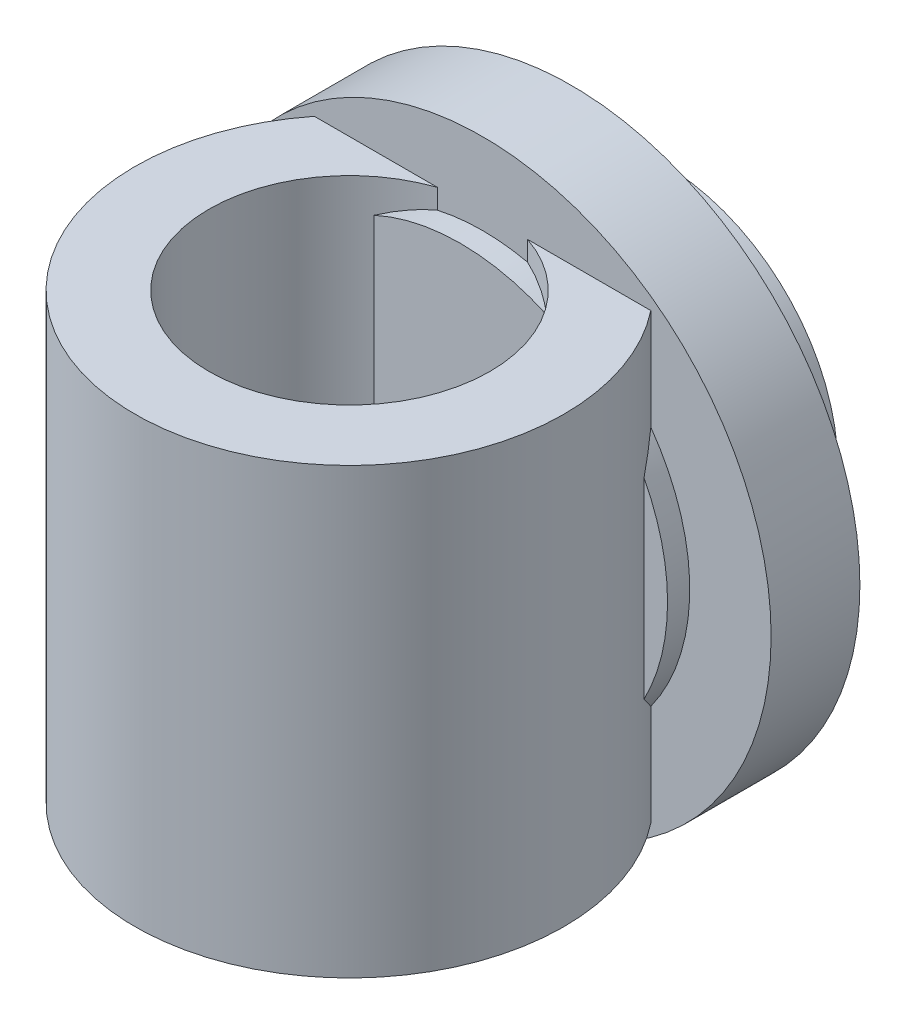
ISO-10303-21;
HEADER;
FILE_DESCRIPTION(('STEP AP214'),'2;1');
FILE_NAME('part.step','',(''),(''),'','','');
FILE_SCHEMA(('AUTOMOTIVE_DESIGN { 1 0 10303 214 1 1 1 1 }'));
ENDSEC;
DATA;
#1=APPLICATION_CONTEXT('core data for automotive mechanical design processes');
#2=APPLICATION_PROTOCOL_DEFINITION('international standard','automotive_design',2000,#1);
#3=PRODUCT_CONTEXT('',#1,'mechanical');
#4=PRODUCT('Part','Part','',(#3));
#5=PRODUCT_RELATED_PRODUCT_CATEGORY('part','',(#4));
#6=PRODUCT_DEFINITION_FORMATION('','',#4);
#7=PRODUCT_DEFINITION_CONTEXT('part definition',#1,'design');
#8=PRODUCT_DEFINITION('design','',#6,#7);
#9=PRODUCT_DEFINITION_SHAPE('','',#8);
#10=(LENGTH_UNIT() NAMED_UNIT(*) SI_UNIT(.MILLI.,.METRE.));
#11=(NAMED_UNIT(*) PLANE_ANGLE_UNIT() SI_UNIT($,.RADIAN.));
#12=(NAMED_UNIT(*) SI_UNIT($,.STERADIAN.) SOLID_ANGLE_UNIT());
#13=UNCERTAINTY_MEASURE_WITH_UNIT(LENGTH_MEASURE(1.E-05),#10,'distance_accuracy_value','');
#14=(GEOMETRIC_REPRESENTATION_CONTEXT(3) GLOBAL_UNCERTAINTY_ASSIGNED_CONTEXT((#13)) GLOBAL_UNIT_ASSIGNED_CONTEXT((#10,
#11,#12)) REPRESENTATION_CONTEXT('',''));
#15=CARTESIAN_POINT('',(0.,0.,0.));
#16=DIRECTION('',(0.,0.,1.));
#17=DIRECTION('',(1.,0.,0.));
#18=AXIS2_PLACEMENT_3D('',#15,#16,#17);
#19=CARTESIAN_POINT('',(0.,0.,30.));
#20=DIRECTION('',(0.,0.,-1.));
#21=DIRECTION('',(-1.,0.,0.));
#22=AXIS2_PLACEMENT_3D('',#19,#20,#21);
#23=CYLINDRICAL_SURFACE('',#22,56.);
#24=CARTESIAN_POINT('',(-23.3238075793812,50.9116882454314,30.));
#25=CARTESIAN_POINT('',(-22.9114463088715,51.1005986286156,29.679419453639));
#26=CARTESIAN_POINT('',(-22.4917791768786,51.286795759074,29.366774842377));
#27=CARTESIAN_POINT('',(-21.6379864935328,51.6528165478896,28.7578360118919));
#28=CARTESIAN_POINT('',(-21.2038595590568,51.8326395931312,28.4615433640263));
#29=CARTESIAN_POINT('',(-19.8870844854698,52.3583008328965,27.6025317360215));
#30=CARTESIAN_POINT('',(-18.9835434950026,52.6933341201847,27.0646190917798));
#31=CARTESIAN_POINT('',(-17.5897673686336,53.1680500647409,26.3120303610085));
#32=CARTESIAN_POINT('',(-17.1186545371853,53.3216810581021,26.0701659874231));
#33=CARTESIAN_POINT('',(-16.1640860022691,53.618765837311,25.6051738803134));
#34=CARTESIAN_POINT('',(-15.6806306210854,53.7622198885263,25.3820456582087));
#35=CARTESIAN_POINT('',(-14.6983501049661,54.0390674144541,24.9536338727811));
#36=CARTESIAN_POINT('',(-14.1994357269894,54.1723755958581,24.7484997656888));
#37=CARTESIAN_POINT('',(-13.1905511740558,54.4268353481768,24.3587035789901));
#38=CARTESIAN_POINT('',(-12.6805794635909,54.5479852173736,24.1740443647398));
#39=CARTESIAN_POINT('',(-12.1655250605964,54.6626014748658,24.));
#40=B_SPLINE_CURVE_WITH_KNOTS('',3,(#24,#25,#26,#27,#28,#29,#30,#31,#32,#33,#34,#35,#36,#37,#38,
#39),.UNSPECIFIED.,.F.,.F.,(4,2,2,2,2,2,2,4),(0.,1.6660040475292,3.33216791353041,
6.63827210156887,8.29206644048741,9.9458176402171,11.6122112121105,13.2788376936681),.UNSPECIFIED.);
#41=CARTESIAN_POINT('',(-23.3238075793812,50.9116882454314,30.));
#42=VERTEX_POINT('',#41);
#43=CARTESIAN_POINT('',(-12.1655250605964,54.6626014748658,24.));
#44=VERTEX_POINT('',#43);
#45=EDGE_CURVE('E213',#42,#44,#40,.T.);
#46=ORIENTED_EDGE('',*,*,#45,.F.);
#47=CARTESIAN_POINT('',(0.,0.,30.));
#48=DIRECTION('',(0.,0.,1.));
#49=DIRECTION('',(1.,0.,0.));
#50=AXIS2_PLACEMENT_3D('',#47,#48,#49);
#51=CIRCLE('',#50,56.);
#52=CARTESIAN_POINT('',(23.3238075793812,50.9116882454314,30.));
#53=VERTEX_POINT('',#52);
#54=EDGE_CURVE('E165',#53,#42,#51,.T.);
#55=ORIENTED_EDGE('',*,*,#54,.F.);
#56=CARTESIAN_POINT('',(12.1655250605964,54.6626014748658,24.));
#57=CARTESIAN_POINT('',(12.6805794635909,54.5479852173736,24.1740443647398));
#58=CARTESIAN_POINT('',(13.1905511740558,54.4268353481768,24.3587035789901));
#59=CARTESIAN_POINT('',(14.1994357269894,54.1723755958581,24.7484997656888));
#60=CARTESIAN_POINT('',(14.6983501049661,54.0390674144541,24.9536338727811));
#61=CARTESIAN_POINT('',(15.6806306210854,53.7622198885263,25.3820456582087));
#62=CARTESIAN_POINT('',(16.1640860022691,53.618765837311,25.6051738803134));
#63=CARTESIAN_POINT('',(17.1186545371853,53.3216810581021,26.0701659874231));
#64=CARTESIAN_POINT('',(17.5897673686336,53.1680500647409,26.3120303610085));
#65=CARTESIAN_POINT('',(18.9835434950026,52.6933341201847,27.0646190917798));
#66=CARTESIAN_POINT('',(19.8870844854698,52.3583008328965,27.6025317360215));
#67=CARTESIAN_POINT('',(21.2038595590568,51.8326395931312,28.4615433640263));
#68=CARTESIAN_POINT('',(21.6379864935328,51.6528165478896,28.7578360118919));
#69=CARTESIAN_POINT('',(22.4917791768786,51.286795759074,29.366774842377));
#70=CARTESIAN_POINT('',(22.9114463088715,51.1005986286156,29.679419453639));
#71=CARTESIAN_POINT('',(23.3238075793812,50.9116882454314,30.));
#72=B_SPLINE_CURVE_WITH_KNOTS('',3,(#56,#57,#58,#59,#60,#61,#62,#63,#64,#65,#66,#67,#68,#69,#70,
#71),.UNSPECIFIED.,.F.,.F.,(4,2,2,2,2,2,2,4),(0.,1.66662648155761,3.33302005345105,
4.98677125318074,6.64056559209927,9.94666978013773,11.6128336461389,13.2788376936681),.UNSPECIFIED.);
#73=CARTESIAN_POINT('',(12.1655250605964,54.6626014748658,24.));
#74=VERTEX_POINT('',#73);
#75=EDGE_CURVE('E63',#74,#53,#72,.T.);
#76=ORIENTED_EDGE('',*,*,#75,.F.);
#77=CARTESIAN_POINT('',(0.,0.,24.));
#78=DIRECTION('',(0.,0.,1.));
#79=DIRECTION('',(1.,0.,0.));
#80=AXIS2_PLACEMENT_3D('',#77,#78,#79);
#81=CIRCLE('',#80,56.);
#82=EDGE_CURVE('E177',#44,#74,#81,.F.);
#83=ORIENTED_EDGE('',*,*,#82,.F.);
#84=EDGE_LOOP('',(#46,#55,#76,#83));
#85=FACE_BOUND('',#84,.T.);
#86=ADVANCED_FACE('F41',(#85),#23,.T.);
#87=CARTESIAN_POINT('',(23.3238075793812,-50.9116882454314,30.));
#88=CARTESIAN_POINT('',(22.9114463088715,-51.1005986286156,29.679419453639));
#89=CARTESIAN_POINT('',(22.4917791768786,-51.286795759074,29.366774842377));
#90=CARTESIAN_POINT('',(21.6379864935328,-51.6528165478896,28.7578360118919));
#91=CARTESIAN_POINT('',(21.2038595590568,-51.8326395931312,28.4615433640263));
#92=CARTESIAN_POINT('',(19.8870844854698,-52.3583008328965,27.6025317360215));
#93=CARTESIAN_POINT('',(18.9835434950026,-52.6933341201847,27.0646190917798));
#94=CARTESIAN_POINT('',(17.5897673686336,-53.1680500647409,26.3120303610085));
#95=CARTESIAN_POINT('',(17.1186545371853,-53.3216810581021,26.0701659874231));
#96=CARTESIAN_POINT('',(16.1640860022691,-53.618765837311,25.6051738803134));
#97=CARTESIAN_POINT('',(15.6806306210854,-53.7622198885263,25.3820456582087));
#98=CARTESIAN_POINT('',(14.6983501049661,-54.0390674144541,24.9536338727811));
#99=CARTESIAN_POINT('',(14.1994357269894,-54.1723755958581,24.7484997656888));
#100=CARTESIAN_POINT('',(13.1905511740558,-54.4268353481768,24.3587035789901));
#101=CARTESIAN_POINT('',(12.6805794635909,-54.5479852173736,24.1740443647398));
#102=CARTESIAN_POINT('',(12.1655250605964,-54.6626014748658,24.));
#103=B_SPLINE_CURVE_WITH_KNOTS('',3,(#87,#88,#89,#90,#91,#92,#93,#94,#95,#96,#97,#98,#99,#100,
#101,#102),.UNSPECIFIED.,.F.,.F.,(4,2,2,2,2,2,2,4),(0.,1.6660040475292,3.33216791353041,
6.63827210156887,8.29206644048741,9.9458176402171,11.6122112121105,13.2788376936681),.UNSPECIFIED.);
#104=CARTESIAN_POINT('',(23.3238075793812,-50.9116882454314,30.));
#105=VERTEX_POINT('',#104);
#106=CARTESIAN_POINT('',(12.1655250605964,-54.6626014748658,24.));
#107=VERTEX_POINT('',#106);
#108=EDGE_CURVE('E134',#105,#107,#103,.T.);
#109=ORIENTED_EDGE('',*,*,#108,.F.);
#110=CARTESIAN_POINT('',(-23.3238075793812,-50.9116882454314,30.));
#111=VERTEX_POINT('',#110);
#112=EDGE_CURVE('E163',#111,#105,#51,.T.);
#113=ORIENTED_EDGE('',*,*,#112,.F.);
#114=CARTESIAN_POINT('',(-12.1655250605964,-54.6626014748658,24.));
#115=CARTESIAN_POINT('',(-12.6805794635909,-54.5479852173736,24.1740443647398));
#116=CARTESIAN_POINT('',(-13.1905511740558,-54.4268353481768,24.3587035789901));
#117=CARTESIAN_POINT('',(-14.1994357269894,-54.1723755958581,24.7484997656888));
#118=CARTESIAN_POINT('',(-14.6983501049661,-54.0390674144541,24.9536338727811));
#119=CARTESIAN_POINT('',(-15.6806306210854,-53.7622198885263,25.3820456582087));
#120=CARTESIAN_POINT('',(-16.1640860022691,-53.618765837311,25.6051738803134));
#121=CARTESIAN_POINT('',(-17.1186545371853,-53.3216810581021,26.0701659874231));
#122=CARTESIAN_POINT('',(-17.5897673686336,-53.1680500647409,26.3120303610085));
#123=CARTESIAN_POINT('',(-18.9835434950026,-52.6933341201847,27.0646190917798));
#124=CARTESIAN_POINT('',(-19.8870844854698,-52.3583008328965,27.6025317360215));
#125=CARTESIAN_POINT('',(-21.2038595590568,-51.8326395931312,28.4615433640263));
#126=CARTESIAN_POINT('',(-21.6379864935328,-51.6528165478896,28.7578360118919));
#127=CARTESIAN_POINT('',(-22.4917791768786,-51.286795759074,29.366774842377));
#128=CARTESIAN_POINT('',(-22.9114463088715,-51.1005986286156,29.679419453639));
#129=CARTESIAN_POINT('',(-23.3238075793812,-50.9116882454314,30.));
#130=B_SPLINE_CURVE_WITH_KNOTS('',3,(#114,#115,#116,#117,#118,#119,#120,#121,#122,#123,#124,
#125,#126,#127,#128,#129),.UNSPECIFIED.,.F.,.F.,(4,2,2,2,2,2,2,4),(0.,1.66662648155761,
3.33302005345105,4.98677125318074,6.64056559209927,9.94666978013773,11.6128336461389,
13.2788376936681),.UNSPECIFIED.);
#131=CARTESIAN_POINT('',(-12.1655250605964,-54.6626014748658,24.));
#132=VERTEX_POINT('',#131);
#133=EDGE_CURVE('E56',#132,#111,#130,.T.);
#134=ORIENTED_EDGE('',*,*,#133,.F.);
#135=EDGE_CURVE('E178',#107,#132,#81,.F.);
#136=ORIENTED_EDGE('',*,*,#135,.F.);
#137=EDGE_LOOP('',(#109,#113,#134,#136));
#138=FACE_BOUND('',#137,.T.);
#139=ADVANCED_FACE('F295',(#138),#23,.T.);
#140=CARTESIAN_POINT('',(49.6386945839634,-25.9229627936314,30.));
#141=VERTEX_POINT('',#140);
#142=CARTESIAN_POINT('',(49.6386945839634,25.9229627936314,30.));
#143=VERTEX_POINT('',#142);
#144=EDGE_CURVE('E159',#141,#143,#51,.T.);
#145=ORIENTED_EDGE('',*,*,#144,.F.);
#146=CARTESIAN_POINT('',(49.6386945839634,-25.9229627936314,30.));
#147=CARTESIAN_POINT('',(49.333693233163,-26.5069550941336,29.4953198767346));
#148=CARTESIAN_POINT('',(49.0183215734381,-27.0857687861314,28.9909024543813));
#149=CARTESIAN_POINT('',(48.3668739351372,-28.2326159982287,27.9843111797481));
#150=CARTESIAN_POINT('',(48.0308151820166,-28.800657985484,27.4821358245194));
#151=CARTESIAN_POINT('',(47.3375267241778,-29.9265023584691,26.4809096570789));
#152=CARTESIAN_POINT('',(46.9802968701535,-30.4843046719487,25.9818588669301));
#153=CARTESIAN_POINT('',(46.2441013604613,-31.5899377656625,24.9876292203131));
#154=CARTESIAN_POINT('',(45.8651180720958,-32.1377599686688,24.4924538853822));
#155=CARTESIAN_POINT('',(45.4752680036083,-32.6802692767364,24.));
#156=B_SPLINE_CURVE_WITH_KNOTS('',3,(#146,#147,#148,#149,#150,#151,#152,#153,#154,#155),
.UNSPECIFIED.,.F.,.F.,(4,2,2,2,4),(0.,2.48970342110896,4.97736107866957,7.46503628217485,
9.95475720673111),.UNSPECIFIED.);
#157=CARTESIAN_POINT('',(45.4752680036083,-32.6802692767364,24.));
#158=VERTEX_POINT('',#157);
#159=EDGE_CURVE('E166',#141,#158,#156,.T.);
#160=ORIENTED_EDGE('',*,*,#159,.T.);
#161=CARTESIAN_POINT('',(45.4752680036083,32.6802692767364,24.));
#162=VERTEX_POINT('',#161);
#163=EDGE_CURVE('E156',#162,#158,#81,.F.);
#164=ORIENTED_EDGE('',*,*,#163,.F.);
#165=CARTESIAN_POINT('',(45.4752680036083,32.6802692767364,24.));
#166=CARTESIAN_POINT('',(45.8651180720958,32.1377599686688,24.4924538853822));
#167=CARTESIAN_POINT('',(46.2441013604613,31.5899377656625,24.9876292203131));
#168=CARTESIAN_POINT('',(46.9802968701535,30.4843046719487,25.9818588669301));
#169=CARTESIAN_POINT('',(47.3375267241778,29.9265023584691,26.4809096570789));
#170=CARTESIAN_POINT('',(48.0308151820166,28.800657985484,27.4821358245194));
#171=CARTESIAN_POINT('',(48.3668739351372,28.2326159982287,27.9843111797481));
#172=CARTESIAN_POINT('',(49.0183215734381,27.0857687861314,28.9909024543813));
#173=CARTESIAN_POINT('',(49.333693233163,26.5069550941336,29.4953198767346));
#174=CARTESIAN_POINT('',(49.6386945839634,25.9229627936314,30.));
#175=B_SPLINE_CURVE_WITH_KNOTS('',3,(#165,#166,#167,#168,#169,#170,#171,#172,#173,#174),
.UNSPECIFIED.,.F.,.F.,(4,2,2,2,4),(0.,2.48972092455627,4.97739612806154,7.46505378562215,
9.95475720673111),.UNSPECIFIED.);
#176=EDGE_CURVE('E276',#162,#143,#175,.T.);
#177=ORIENTED_EDGE('',*,*,#176,.T.);
#178=EDGE_LOOP('',(#145,#160,#164,#177));
#179=FACE_BOUND('',#178,.T.);
#180=ADVANCED_FACE('F301',(#179),#23,.T.);
#181=CARTESIAN_POINT('',(0.,0.,30.));
#182=DIRECTION('',(0.,0.,1.));
#183=DIRECTION('',(1.,0.,0.));
#184=AXIS2_PLACEMENT_3D('',#181,#182,#183);
#185=PLANE('',#184);
#186=ORIENTED_EDGE('',*,*,#112,.T.);
#187=DIRECTION('',(0.,1.,0.));
#188=VECTOR('',#187,1.);
#189=CARTESIAN_POINT('',(23.3238075793812,-60.,30.));
#190=LINE('',#189,#188);
#191=EDGE_CURVE('E193',#105,#53,#190,.T.);
#192=ORIENTED_EDGE('',*,*,#191,.T.);
#193=ORIENTED_EDGE('',*,*,#54,.T.);
#194=DIRECTION('',(0.,1.,0.));
#195=VECTOR('',#194,1.);
#196=CARTESIAN_POINT('',(-23.3238075793812,-60.,30.));
#197=LINE('',#196,#195);
#198=EDGE_CURVE('E189',#42,#111,#197,.F.);
#199=ORIENTED_EDGE('',*,*,#198,.T.);
#200=EDGE_LOOP('',(#186,#192,#193,#199));
#201=FACE_BOUND('',#200,.T.);
#202=ADVANCED_FACE('F311',(#201),#185,.T.);
#203=DIRECTION('',(0.,1.,0.));
#204=VECTOR('',#203,1.);
#205=CARTESIAN_POINT('',(49.6386945839634,-60.,30.));
#206=LINE('',#205,#204);
#207=EDGE_CURVE('E197',#141,#143,#206,.T.);
#208=ORIENTED_EDGE('',*,*,#207,.F.);
#209=ORIENTED_EDGE('',*,*,#144,.T.);
#210=EDGE_LOOP('',(#208,#209));
#211=FACE_BOUND('',#210,.T.);
#212=ADVANCED_FACE('F312',(#211),#185,.T.);
#213=CARTESIAN_POINT('',(0.,0.,-25.));
#214=DIRECTION('',(0.,0.,1.));
#215=DIRECTION('',(1.,0.,0.));
#216=AXIS2_PLACEMENT_3D('',#213,#214,#215);
#217=CYLINDRICAL_SURFACE('',#216,47.);
#218=CARTESIAN_POINT('',(0.,0.,-25.));
#219=DIRECTION('',(0.,0.,1.));
#220=DIRECTION('',(1.,0.,0.));
#221=AXIS2_PLACEMENT_3D('',#218,#219,#220);
#222=CIRCLE('',#221,47.);
#223=CARTESIAN_POINT('',(47.,0.,-25.));
#224=VERTEX_POINT('',#223);
#225=EDGE_CURVE('E186',#224,#224,#222,.T.);
#226=ORIENTED_EDGE('',*,*,#225,.T.);
#227=EDGE_LOOP('',(#226));
#228=FACE_BOUND('',#227,.T.);
#229=CARTESIAN_POINT('',(0.,0.,0.));
#230=DIRECTION('',(0.,0.,1.));
#231=DIRECTION('',(1.,0.,0.));
#232=AXIS2_PLACEMENT_3D('',#229,#230,#231);
#233=CIRCLE('',#232,47.);
#234=CARTESIAN_POINT('',(47.,0.,0.));
#235=VERTEX_POINT('',#234);
#236=EDGE_CURVE('E182',#235,#235,#233,.T.);
#237=ORIENTED_EDGE('',*,*,#236,.F.);
#238=EDGE_LOOP('',(#237));
#239=FACE_BOUND('',#238,.T.);
#240=ADVANCED_FACE('F43',(#228,#239),#217,.T.);
#241=CARTESIAN_POINT('',(0.,0.,-25.));
#242=DIRECTION('',(0.,0.,1.));
#243=DIRECTION('',(1.,0.,0.));
#244=AXIS2_PLACEMENT_3D('',#241,#242,#243);
#245=PLANE('',#244);
#246=ORIENTED_EDGE('',*,*,#225,.F.);
#247=EDGE_LOOP('',(#246));
#248=FACE_BOUND('',#247,.T.);
#249=ADVANCED_FACE('F328',(#248),#245,.F.);
#250=CARTESIAN_POINT('',(0.,0.,24.));
#251=DIRECTION('',(0.,0.,-1.));
#252=DIRECTION('',(-1.,0.,0.));
#253=AXIS2_PLACEMENT_3D('',#250,#251,#252);
#254=CYLINDRICAL_SURFACE('',#253,78.);
#255=CARTESIAN_POINT('',(0.,0.,24.));
#256=DIRECTION('',(0.,0.,1.));
#257=DIRECTION('',(1.,0.,0.));
#258=AXIS2_PLACEMENT_3D('',#255,#256,#257);
#259=CIRCLE('',#258,78.);
#260=CARTESIAN_POINT('',(78.,0.,24.));
#261=VERTEX_POINT('',#260);
#262=EDGE_CURVE('E179',#261,#261,#259,.T.);
#263=ORIENTED_EDGE('',*,*,#262,.F.);
#264=EDGE_LOOP('',(#263));
#265=FACE_BOUND('',#264,.T.);
#266=CARTESIAN_POINT('',(0.,0.,0.));
#267=DIRECTION('',(0.,0.,1.));
#268=DIRECTION('',(1.,0.,0.));
#269=AXIS2_PLACEMENT_3D('',#266,#267,#268);
#270=CIRCLE('',#269,78.);
#271=CARTESIAN_POINT('',(78.,0.,0.));
#272=VERTEX_POINT('',#271);
#273=EDGE_CURVE('E183',#272,#272,#270,.T.);
#274=ORIENTED_EDGE('',*,*,#273,.T.);
#275=EDGE_LOOP('',(#274));
#276=FACE_BOUND('',#275,.T.);
#277=ADVANCED_FACE('F333',(#265,#276),#254,.T.);
#278=CARTESIAN_POINT('',(0.,0.,24.));
#279=DIRECTION('',(0.,0.,1.));
#280=DIRECTION('',(1.,0.,0.));
#281=AXIS2_PLACEMENT_3D('',#278,#279,#280);
#282=PLANE('',#281);
#283=DIRECTION('',(0.,1.,0.));
#284=VECTOR('',#283,1.);
#285=CARTESIAN_POINT('',(45.4752680036083,-60.,24.));
#286=LINE('',#285,#284);
#287=CARTESIAN_POINT('',(45.4752680036083,-60.,24.));
#288=VERTEX_POINT('',#287);
#289=EDGE_CURVE('E153',#288,#158,#286,.T.);
#290=ORIENTED_EDGE('',*,*,#289,.F.);
#291=DIRECTION('',(-1.,0.,0.));
#292=VECTOR('',#291,1.);
#293=CARTESIAN_POINT('',(0.,-60.,24.));
#294=LINE('',#293,#292);
#295=CARTESIAN_POINT('',(12.1655250605964,-60.,24.));
#296=VERTEX_POINT('',#295);
#297=EDGE_CURVE('E11',#288,#296,#294,.T.);
#298=ORIENTED_EDGE('',*,*,#297,.T.);
#299=DIRECTION('',(0.,1.,0.));
#300=VECTOR('',#299,1.);
#301=CARTESIAN_POINT('',(12.1655250605964,-60.,24.));
#302=LINE('',#301,#300);
#303=EDGE_CURVE('E128',#296,#107,#302,.T.);
#304=ORIENTED_EDGE('',*,*,#303,.T.);
#305=ORIENTED_EDGE('',*,*,#135,.T.);
#306=DIRECTION('',(0.,1.,0.));
#307=VECTOR('',#306,1.);
#308=CARTESIAN_POINT('',(-12.1655250605964,-60.,24.));
#309=LINE('',#308,#307);
#310=CARTESIAN_POINT('',(-12.1655250605964,-60.,24.));
#311=VERTEX_POINT('',#310);
#312=EDGE_CURVE('E211',#132,#311,#309,.F.);
#313=ORIENTED_EDGE('',*,*,#312,.T.);
#314=CARTESIAN_POINT('',(-45.4752680036083,-60.,24.));
#315=VERTEX_POINT('',#314);
#316=EDGE_CURVE('E45',#311,#315,#294,.T.);
#317=ORIENTED_EDGE('',*,*,#316,.T.);
#318=DIRECTION('',(0.,1.,0.));
#319=VECTOR('',#318,1.);
#320=CARTESIAN_POINT('',(-45.4752680036083,-60.,24.));
#321=LINE('',#320,#319);
#322=CARTESIAN_POINT('',(-45.4752680036083,-32.6802692767364,24.));
#323=VERTEX_POINT('',#322);
#324=EDGE_CURVE('E209',#323,#315,#321,.F.);
#325=ORIENTED_EDGE('',*,*,#324,.F.);
#326=CARTESIAN_POINT('',(-45.4752680036083,32.6802692767364,24.));
#327=VERTEX_POINT('',#326);
#328=EDGE_CURVE('E286',#323,#327,#81,.F.);
#329=ORIENTED_EDGE('',*,*,#328,.T.);
#330=CARTESIAN_POINT('',(-45.4752680036083,60.,24.));
#331=VERTEX_POINT('',#330);
#332=EDGE_CURVE('E282',#331,#327,#321,.F.);
#333=ORIENTED_EDGE('',*,*,#332,.F.);
#334=DIRECTION('',(-1.,0.,0.));
#335=VECTOR('',#334,1.);
#336=CARTESIAN_POINT('',(0.,60.,24.));
#337=LINE('',#336,#335);
#338=CARTESIAN_POINT('',(-12.1655250605964,60.,24.));
#339=VERTEX_POINT('',#338);
#340=EDGE_CURVE('E198',#339,#331,#337,.T.);
#341=ORIENTED_EDGE('',*,*,#340,.F.);
#342=EDGE_CURVE('E212',#339,#44,#309,.F.);
#343=ORIENTED_EDGE('',*,*,#342,.T.);
#344=ORIENTED_EDGE('',*,*,#82,.T.);
#345=CARTESIAN_POINT('',(12.1655250605964,60.,24.));
#346=VERTEX_POINT('',#345);
#347=EDGE_CURVE('E139',#74,#346,#302,.T.);
#348=ORIENTED_EDGE('',*,*,#347,.T.);
#349=CARTESIAN_POINT('',(45.4752680036083,60.,24.));
#350=VERTEX_POINT('',#349);
#351=EDGE_CURVE('E199',#350,#346,#337,.T.);
#352=ORIENTED_EDGE('',*,*,#351,.F.);
#353=EDGE_CURVE('E160',#162,#350,#286,.T.);
#354=ORIENTED_EDGE('',*,*,#353,.F.);
#355=ORIENTED_EDGE('',*,*,#163,.T.);
#356=EDGE_LOOP('',(#290,#298,#304,#305,#313,#317,#325,#329,#333,#341,#343,#344,#348,#352,#354,#355));
#357=FACE_BOUND('',#356,.T.);
#358=ORIENTED_EDGE('',*,*,#262,.T.);
#359=EDGE_LOOP('',(#358));
#360=FACE_BOUND('',#359,.T.);
#361=ADVANCED_FACE('F150',(#357,#360),#282,.T.);
#362=CARTESIAN_POINT('',(0.,0.,0.));
#363=DIRECTION('',(0.,0.,1.));
#364=DIRECTION('',(1.,0.,0.));
#365=AXIS2_PLACEMENT_3D('',#362,#363,#364);
#366=PLANE('',#365);
#367=ORIENTED_EDGE('',*,*,#273,.F.);
#368=EDGE_LOOP('',(#367));
#369=FACE_BOUND('',#368,.T.);
#370=ORIENTED_EDGE('',*,*,#236,.T.);
#371=EDGE_LOOP('',(#370));
#372=FACE_BOUND('',#371,.T.);
#373=ADVANCED_FACE('F305',(#369,#372),#366,.F.);
#374=CARTESIAN_POINT('',(-49.6386945839634,25.9229627936314,30.));
#375=VERTEX_POINT('',#374);
#376=CARTESIAN_POINT('',(-49.6386945839634,-25.9229627936314,30.));
#377=VERTEX_POINT('',#376);
#378=EDGE_CURVE('E288',#375,#377,#51,.T.);
#379=ORIENTED_EDGE('',*,*,#378,.F.);
#380=CARTESIAN_POINT('',(-49.6386945839634,25.9229627936314,30.));
#381=CARTESIAN_POINT('',(-49.333693233163,26.5069550941336,29.4953198767346));
#382=CARTESIAN_POINT('',(-49.0183215734381,27.0857687861314,28.9909024543813));
#383=CARTESIAN_POINT('',(-48.3668739351372,28.2326159982287,27.9843111797481));
#384=CARTESIAN_POINT('',(-48.0308151820166,28.800657985484,27.4821358245194));
#385=CARTESIAN_POINT('',(-47.3375267241778,29.9265023584691,26.4809096570789));
#386=CARTESIAN_POINT('',(-46.9802968701535,30.4843046719487,25.9818588669301));
#387=CARTESIAN_POINT('',(-46.2441013604613,31.5899377656625,24.9876292203131));
#388=CARTESIAN_POINT('',(-45.8651180720958,32.1377599686688,24.4924538853822));
#389=CARTESIAN_POINT('',(-45.4752680036083,32.6802692767364,24.));
#390=B_SPLINE_CURVE_WITH_KNOTS('',3,(#380,#381,#382,#383,#384,#385,#386,#387,#388,#389),
.UNSPECIFIED.,.F.,.F.,(4,2,2,2,4),(0.,2.48970342110896,4.97736107866957,7.46503628217485,
9.95475720673111),.UNSPECIFIED.);
#391=EDGE_CURVE('E263',#375,#327,#390,.T.);
#392=ORIENTED_EDGE('',*,*,#391,.T.);
#393=ORIENTED_EDGE('',*,*,#328,.F.);
#394=CARTESIAN_POINT('',(-45.4752680036083,-32.6802692767364,24.));
#395=CARTESIAN_POINT('',(-45.8651180720958,-32.1377599686688,24.4924538853822));
#396=CARTESIAN_POINT('',(-46.2441013604613,-31.5899377656625,24.9876292203131));
#397=CARTESIAN_POINT('',(-46.9802968701535,-30.4843046719487,25.9818588669301));
#398=CARTESIAN_POINT('',(-47.3375267241778,-29.9265023584691,26.4809096570789));
#399=CARTESIAN_POINT('',(-48.0308151820166,-28.800657985484,27.4821358245194));
#400=CARTESIAN_POINT('',(-48.3668739351372,-28.2326159982287,27.9843111797481));
#401=CARTESIAN_POINT('',(-49.0183215734381,-27.0857687861314,28.9909024543813));
#402=CARTESIAN_POINT('',(-49.333693233163,-26.5069550941336,29.4953198767346));
#403=CARTESIAN_POINT('',(-49.6386945839634,-25.9229627936314,30.));
#404=B_SPLINE_CURVE_WITH_KNOTS('',3,(#394,#395,#396,#397,#398,#399,#400,#401,#402,#403),
.UNSPECIFIED.,.F.,.F.,(4,2,2,2,4),(0.,2.48972092455627,4.97739612806154,7.46505378562215,
9.95475720673111),.UNSPECIFIED.);
#405=EDGE_CURVE('E138',#323,#377,#404,.T.);
#406=ORIENTED_EDGE('',*,*,#405,.T.);
#407=EDGE_LOOP('',(#379,#392,#393,#406));
#408=FACE_BOUND('',#407,.T.);
#409=ADVANCED_FACE('F233',(#408),#23,.T.);
#410=DIRECTION('',(0.,1.,0.));
#411=VECTOR('',#410,1.);
#412=CARTESIAN_POINT('',(-49.6386945839634,-60.,30.));
#413=LINE('',#412,#411);
#414=EDGE_CURVE('E195',#375,#377,#413,.F.);
#415=ORIENTED_EDGE('',*,*,#414,.F.);
#416=ORIENTED_EDGE('',*,*,#378,.T.);
#417=EDGE_LOOP('',(#415,#416));
#418=FACE_BOUND('',#417,.T.);
#419=ADVANCED_FACE('F272',(#418),#185,.T.);
#420=CARTESIAN_POINT('',(0.,-60.,60.));
#421=DIRECTION('',(0.,1.,0.));
#422=DIRECTION('',(0.,0.,1.));
#423=AXIS2_PLACEMENT_3D('',#420,#421,#422);
#424=CYLINDRICAL_SURFACE('',#423,58.);
#425=CARTESIAN_POINT('',(0.,-60.,60.));
#426=DIRECTION('',(0.,1.,0.));
#427=DIRECTION('',(0.,0.,1.));
#428=AXIS2_PLACEMENT_3D('',#425,#426,#427);
#429=CIRCLE('',#428,58.);
#430=EDGE_CURVE('E146',#315,#288,#429,.T.);
#431=ORIENTED_EDGE('',*,*,#430,.T.);
#432=ORIENTED_EDGE('',*,*,#289,.T.);
#433=ORIENTED_EDGE('',*,*,#159,.F.);
#434=ORIENTED_EDGE('',*,*,#207,.T.);
#435=ORIENTED_EDGE('',*,*,#176,.F.);
#436=ORIENTED_EDGE('',*,*,#353,.T.);
#437=CARTESIAN_POINT('',(0.,60.,60.));
#438=DIRECTION('',(0.,1.,0.));
#439=DIRECTION('',(0.,0.,1.));
#440=AXIS2_PLACEMENT_3D('',#437,#438,#439);
#441=CIRCLE('',#440,58.);
#442=EDGE_CURVE('E147',#331,#350,#441,.T.);
#443=ORIENTED_EDGE('',*,*,#442,.F.);
#444=ORIENTED_EDGE('',*,*,#332,.T.);
#445=ORIENTED_EDGE('',*,*,#391,.F.);
#446=ORIENTED_EDGE('',*,*,#414,.T.);
#447=ORIENTED_EDGE('',*,*,#405,.F.);
#448=ORIENTED_EDGE('',*,*,#324,.T.);
#449=EDGE_LOOP('',(#431,#432,#433,#434,#435,#436,#443,#444,#445,#446,#447,#448));
#450=FACE_BOUND('',#449,.T.);
#451=ADVANCED_FACE('F269',(#450),#424,.T.);
#452=CARTESIAN_POINT('',(0.,-60.,60.));
#453=DIRECTION('',(0.,1.,0.));
#454=DIRECTION('',(0.,0.,1.));
#455=AXIS2_PLACEMENT_3D('',#452,#453,#454);
#456=PLANE('',#455);
#457=ORIENTED_EDGE('',*,*,#297,.F.);
#458=ORIENTED_EDGE('',*,*,#430,.F.);
#459=ORIENTED_EDGE('',*,*,#316,.F.);
#460=CARTESIAN_POINT('',(0.,-60.,60.));
#461=DIRECTION('',(0.,1.,0.));
#462=DIRECTION('',(0.,0.,1.));
#463=AXIS2_PLACEMENT_3D('',#460,#461,#462);
#464=CIRCLE('',#463,38.);
#465=EDGE_CURVE('E131',#311,#296,#464,.T.);
#466=ORIENTED_EDGE('',*,*,#465,.T.);
#467=EDGE_LOOP('',(#457,#458,#459,#466));
#468=FACE_BOUND('',#467,.T.);
#469=ADVANCED_FACE('F142',(#468),#456,.F.);
#470=CARTESIAN_POINT('',(0.,-60.,60.));
#471=DIRECTION('',(0.,1.,0.));
#472=DIRECTION('',(0.,0.,1.));
#473=AXIS2_PLACEMENT_3D('',#470,#471,#472);
#474=CYLINDRICAL_SURFACE('',#473,38.);
#475=ORIENTED_EDGE('',*,*,#303,.F.);
#476=ORIENTED_EDGE('',*,*,#465,.F.);
#477=ORIENTED_EDGE('',*,*,#312,.F.);
#478=ORIENTED_EDGE('',*,*,#133,.T.);
#479=ORIENTED_EDGE('',*,*,#198,.F.);
#480=ORIENTED_EDGE('',*,*,#45,.T.);
#481=ORIENTED_EDGE('',*,*,#342,.F.);
#482=CARTESIAN_POINT('',(0.,60.,60.));
#483=DIRECTION('',(0.,1.,0.));
#484=DIRECTION('',(0.,0.,1.));
#485=AXIS2_PLACEMENT_3D('',#482,#483,#484);
#486=CIRCLE('',#485,38.);
#487=EDGE_CURVE('E252',#339,#346,#486,.T.);
#488=ORIENTED_EDGE('',*,*,#487,.T.);
#489=ORIENTED_EDGE('',*,*,#347,.F.);
#490=ORIENTED_EDGE('',*,*,#75,.T.);
#491=ORIENTED_EDGE('',*,*,#191,.F.);
#492=ORIENTED_EDGE('',*,*,#108,.T.);
#493=EDGE_LOOP('',(#475,#476,#477,#478,#479,#480,#481,#488,#489,#490,#491,#492));
#494=FACE_BOUND('',#493,.T.);
#495=ADVANCED_FACE('F130',(#494),#474,.F.);
#496=CARTESIAN_POINT('',(0.,60.,60.));
#497=DIRECTION('',(0.,1.,0.));
#498=DIRECTION('',(0.,0.,1.));
#499=AXIS2_PLACEMENT_3D('',#496,#497,#498);
#500=PLANE('',#499);
#501=ORIENTED_EDGE('',*,*,#442,.T.);
#502=ORIENTED_EDGE('',*,*,#351,.T.);
#503=ORIENTED_EDGE('',*,*,#487,.F.);
#504=ORIENTED_EDGE('',*,*,#340,.T.);
#505=EDGE_LOOP('',(#501,#502,#503,#504));
#506=FACE_BOUND('',#505,.T.);
#507=ADVANCED_FACE('F241',(#506),#500,.T.);
#508=CLOSED_SHELL('',(#86,#139,#180,#202,#212,#240,#249,#277,#361,#373,#409,#419,#451,#469,#495,#507));
#509=MANIFOLD_SOLID_BREP('B2',#508);
#510=ADVANCED_BREP_SHAPE_REPRESENTATION('',(#18,#509),#14);
#511=SHAPE_DEFINITION_REPRESENTATION(#9,#510);
ENDSEC;
END-ISO-10303-21;
